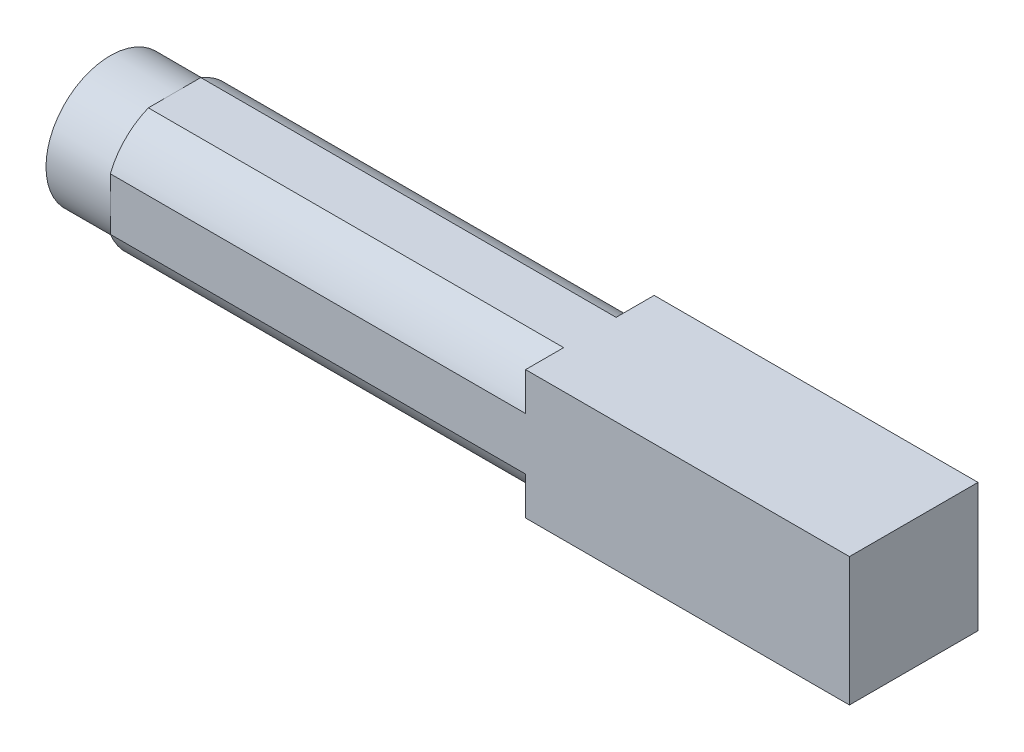
ISO-10303-21;
HEADER;
FILE_DESCRIPTION(('STEP AP214'),'2;1');
FILE_NAME('part.step','',(''),(''),'','','');
FILE_SCHEMA(('AUTOMOTIVE_DESIGN { 1 0 10303 214 1 1 1 1 }'));
ENDSEC;
DATA;
#1=APPLICATION_CONTEXT('core data for automotive mechanical design processes');
#2=APPLICATION_PROTOCOL_DEFINITION('international standard','automotive_design',2000,#1);
#3=PRODUCT_CONTEXT('',#1,'mechanical');
#4=PRODUCT('Part','Part','',(#3));
#5=PRODUCT_RELATED_PRODUCT_CATEGORY('part','',(#4));
#6=PRODUCT_DEFINITION_FORMATION('','',#4);
#7=PRODUCT_DEFINITION_CONTEXT('part definition',#1,'design');
#8=PRODUCT_DEFINITION('design','',#6,#7);
#9=PRODUCT_DEFINITION_SHAPE('','',#8);
#10=(LENGTH_UNIT() NAMED_UNIT(*) SI_UNIT(.MILLI.,.METRE.));
#11=(NAMED_UNIT(*) PLANE_ANGLE_UNIT() SI_UNIT($,.RADIAN.));
#12=(NAMED_UNIT(*) SI_UNIT($,.STERADIAN.) SOLID_ANGLE_UNIT());
#13=UNCERTAINTY_MEASURE_WITH_UNIT(LENGTH_MEASURE(1.E-05),#10,'distance_accuracy_value','');
#14=(GEOMETRIC_REPRESENTATION_CONTEXT(3) GLOBAL_UNCERTAINTY_ASSIGNED_CONTEXT((#13)) GLOBAL_UNIT_ASSIGNED_CONTEXT((#10,
#11,#12)) REPRESENTATION_CONTEXT('',''));
#15=CARTESIAN_POINT('',(0.,0.,0.));
#16=DIRECTION('',(0.,0.,1.));
#17=DIRECTION('',(1.,0.,0.));
#18=AXIS2_PLACEMENT_3D('',#15,#16,#17);
#19=CARTESIAN_POINT('',(39.6875,-3.175,-3.175));
#20=DIRECTION('',(0.,0.,1.));
#21=DIRECTION('',(1.,0.,0.));
#22=AXIS2_PLACEMENT_3D('',#19,#20,#21);
#23=PLANE('',#22);
#24=DIRECTION('',(-1.,0.,0.));
#25=VECTOR('',#24,1.);
#26=CARTESIAN_POINT('',(36.8423013006725,-1.29515095645257,-3.175));
#27=LINE('',#26,#25);
#28=CARTESIAN_POINT('',(3.175,-1.29515095645257,-3.175));
#29=VERTEX_POINT('',#28);
#30=CARTESIAN_POINT('',(23.6906250002226,-1.29515095645257,-3.175));
#31=VERTEX_POINT('',#30);
#32=EDGE_CURVE('E278',#29,#31,#27,.F.);
#33=ORIENTED_EDGE('',*,*,#32,.F.);
#34=DIRECTION('',(0.,1.,0.));
#35=VECTOR('',#34,1.);
#36=CARTESIAN_POINT('',(3.175,-3.175,-3.175));
#37=LINE('',#36,#35);
#38=CARTESIAN_POINT('',(3.175,0.,-3.175));
#39=VERTEX_POINT('',#38);
#40=EDGE_CURVE('E205',#29,#39,#37,.T.);
#41=ORIENTED_EDGE('',*,*,#40,.T.);
#42=CARTESIAN_POINT('',(3.175,1.29515095645257,-3.175));
#43=VERTEX_POINT('',#42);
#44=EDGE_CURVE('E201',#39,#43,#37,.T.);
#45=ORIENTED_EDGE('',*,*,#44,.T.);
#46=DIRECTION('',(-1.,0.,0.));
#47=VECTOR('',#46,1.);
#48=CARTESIAN_POINT('',(36.8423013006725,1.29515095645257,-3.175));
#49=LINE('',#48,#47);
#50=CARTESIAN_POINT('',(23.6906250002226,1.29515095645257,-3.175));
#51=VERTEX_POINT('',#50);
#52=EDGE_CURVE('E70',#51,#43,#49,.T.);
#53=ORIENTED_EDGE('',*,*,#52,.F.);
#54=DIRECTION('',(0.,1.,0.));
#55=VECTOR('',#54,1.);
#56=CARTESIAN_POINT('',(23.6906250002226,-3.175,-3.175));
#57=LINE('',#56,#55);
#58=CARTESIAN_POINT('',(23.6906250002226,3.175,-3.175));
#59=VERTEX_POINT('',#58);
#60=EDGE_CURVE('E260',#51,#59,#57,.T.);
#61=ORIENTED_EDGE('',*,*,#60,.T.);
#62=DIRECTION('',(-1.,0.,0.));
#63=VECTOR('',#62,1.);
#64=CARTESIAN_POINT('',(39.6875,3.175,-3.175));
#65=LINE('',#64,#63);
#66=CARTESIAN_POINT('',(39.6875,3.175,-3.175));
#67=VERTEX_POINT('',#66);
#68=EDGE_CURVE('E226',#67,#59,#65,.T.);
#69=ORIENTED_EDGE('',*,*,#68,.F.);
#70=DIRECTION('',(0.,1.,0.));
#71=VECTOR('',#70,1.);
#72=CARTESIAN_POINT('',(39.6875,-3.175,-3.175));
#73=LINE('',#72,#71);
#74=CARTESIAN_POINT('',(39.6875,-3.175,-3.175));
#75=VERTEX_POINT('',#74);
#76=EDGE_CURVE('E206',#75,#67,#73,.T.);
#77=ORIENTED_EDGE('',*,*,#76,.F.);
#78=DIRECTION('',(-1.,0.,0.));
#79=VECTOR('',#78,1.);
#80=CARTESIAN_POINT('',(39.6875,-3.175,-3.175));
#81=LINE('',#80,#79);
#82=CARTESIAN_POINT('',(23.6906250002226,-3.175,-3.175));
#83=VERTEX_POINT('',#82);
#84=EDGE_CURVE('E215',#75,#83,#81,.T.);
#85=ORIENTED_EDGE('',*,*,#84,.T.);
#86=EDGE_CURVE('E277',#83,#31,#57,.T.);
#87=ORIENTED_EDGE('',*,*,#86,.T.);
#88=EDGE_LOOP('',(#33,#41,#45,#53,#61,#69,#77,#85,#87));
#89=FACE_BOUND('',#88,.T.);
#90=ADVANCED_FACE('F45',(#89),#23,.F.);
#91=CARTESIAN_POINT('',(39.6875,3.175,3.175));
#92=DIRECTION('',(0.,-1.,0.));
#93=DIRECTION('',(0.,0.,-1.));
#94=AXIS2_PLACEMENT_3D('',#91,#92,#93);
#95=PLANE('',#94);
#96=DIRECTION('',(-1.,0.,0.));
#97=VECTOR('',#96,1.);
#98=CARTESIAN_POINT('',(36.8423013006725,3.175,-1.29515095645257));
#99=LINE('',#98,#97);
#100=CARTESIAN_POINT('',(3.175,3.175,-1.29515095645257));
#101=VERTEX_POINT('',#100);
#102=CARTESIAN_POINT('',(23.6906250002226,3.175,-1.29515095645257));
#103=VERTEX_POINT('',#102);
#104=EDGE_CURVE('E273',#101,#103,#99,.F.);
#105=ORIENTED_EDGE('',*,*,#104,.F.);
#106=DIRECTION('',(0.,0.,1.));
#107=VECTOR('',#106,1.);
#108=CARTESIAN_POINT('',(3.175,3.175,3.175));
#109=LINE('',#108,#107);
#110=CARTESIAN_POINT('',(3.175,3.175,0.));
#111=VERTEX_POINT('',#110);
#112=EDGE_CURVE('E196',#101,#111,#109,.T.);
#113=ORIENTED_EDGE('',*,*,#112,.T.);
#114=CARTESIAN_POINT('',(3.175,3.175,1.29515095645257));
#115=VERTEX_POINT('',#114);
#116=EDGE_CURVE('E193',#111,#115,#109,.T.);
#117=ORIENTED_EDGE('',*,*,#116,.T.);
#118=DIRECTION('',(-1.,0.,0.));
#119=VECTOR('',#118,1.);
#120=CARTESIAN_POINT('',(36.8423013006725,3.175,1.29515095645257));
#121=LINE('',#120,#119);
#122=CARTESIAN_POINT('',(23.6906250002226,3.175,1.29515095645257));
#123=VERTEX_POINT('',#122);
#124=EDGE_CURVE('E169',#123,#115,#121,.T.);
#125=ORIENTED_EDGE('',*,*,#124,.F.);
#126=DIRECTION('',(0.,0.,1.));
#127=VECTOR('',#126,1.);
#128=CARTESIAN_POINT('',(23.6906250002226,3.175,3.17500000000001));
#129=LINE('',#128,#127);
#130=CARTESIAN_POINT('',(23.6906250002226,3.175,3.175));
#131=VERTEX_POINT('',#130);
#132=EDGE_CURVE('E272',#123,#131,#129,.T.);
#133=ORIENTED_EDGE('',*,*,#132,.T.);
#134=DIRECTION('',(-1.,0.,0.));
#135=VECTOR('',#134,1.);
#136=CARTESIAN_POINT('',(39.6875,3.175,3.175));
#137=LINE('',#136,#135);
#138=CARTESIAN_POINT('',(39.6875,3.175,3.175));
#139=VERTEX_POINT('',#138);
#140=EDGE_CURVE('E223',#139,#131,#137,.T.);
#141=ORIENTED_EDGE('',*,*,#140,.F.);
#142=DIRECTION('',(0.,0.,1.));
#143=VECTOR('',#142,1.);
#144=CARTESIAN_POINT('',(39.6875,3.175,3.175));
#145=LINE('',#144,#143);
#146=EDGE_CURVE('E209',#67,#139,#145,.T.);
#147=ORIENTED_EDGE('',*,*,#146,.F.);
#148=ORIENTED_EDGE('',*,*,#68,.T.);
#149=EDGE_CURVE('E269',#59,#103,#129,.T.);
#150=ORIENTED_EDGE('',*,*,#149,.T.);
#151=EDGE_LOOP('',(#105,#113,#117,#125,#133,#141,#147,#148,#150));
#152=FACE_BOUND('',#151,.T.);
#153=ADVANCED_FACE('F324',(#152),#95,.F.);
#154=CARTESIAN_POINT('',(39.6875,-3.175,3.175));
#155=DIRECTION('',(0.,0.,-1.));
#156=DIRECTION('',(-1.,0.,0.));
#157=AXIS2_PLACEMENT_3D('',#154,#155,#156);
#158=PLANE('',#157);
#159=DIRECTION('',(-1.,0.,0.));
#160=VECTOR('',#159,1.);
#161=CARTESIAN_POINT('',(36.8423013006725,1.29515095645257,3.175));
#162=LINE('',#161,#160);
#163=CARTESIAN_POINT('',(3.175,1.29515095645257,3.175));
#164=VERTEX_POINT('',#163);
#165=CARTESIAN_POINT('',(23.6906250002226,1.29515095645257,3.175));
#166=VERTEX_POINT('',#165);
#167=EDGE_CURVE('E166',#164,#166,#162,.F.);
#168=ORIENTED_EDGE('',*,*,#167,.F.);
#169=DIRECTION('',(0.,-1.,0.));
#170=VECTOR('',#169,1.);
#171=CARTESIAN_POINT('',(3.175,-3.175,3.175));
#172=LINE('',#171,#170);
#173=CARTESIAN_POINT('',(3.175,0.,3.175));
#174=VERTEX_POINT('',#173);
#175=EDGE_CURVE('E182',#164,#174,#172,.T.);
#176=ORIENTED_EDGE('',*,*,#175,.T.);
#177=CARTESIAN_POINT('',(3.175,-1.29515095645257,3.175));
#178=VERTEX_POINT('',#177);
#179=EDGE_CURVE('E194',#174,#178,#172,.T.);
#180=ORIENTED_EDGE('',*,*,#179,.T.);
#181=DIRECTION('',(-1.,0.,0.));
#182=VECTOR('',#181,1.);
#183=CARTESIAN_POINT('',(36.8423013006725,-1.29515095645257,3.175));
#184=LINE('',#183,#182);
#185=CARTESIAN_POINT('',(23.6906250002226,-1.29515095645257,3.175));
#186=VERTEX_POINT('',#185);
#187=EDGE_CURVE('E187',#186,#178,#184,.T.);
#188=ORIENTED_EDGE('',*,*,#187,.F.);
#189=DIRECTION('',(0.,-1.,0.));
#190=VECTOR('',#189,1.);
#191=CARTESIAN_POINT('',(23.6906250002226,-3.175,3.175));
#192=LINE('',#191,#190);
#193=CARTESIAN_POINT('',(23.6906250002226,-3.175,3.175));
#194=VERTEX_POINT('',#193);
#195=EDGE_CURVE('E296',#186,#194,#192,.T.);
#196=ORIENTED_EDGE('',*,*,#195,.T.);
#197=DIRECTION('',(-1.,0.,0.));
#198=VECTOR('',#197,1.);
#199=CARTESIAN_POINT('',(39.6875,-3.175,3.175));
#200=LINE('',#199,#198);
#201=CARTESIAN_POINT('',(39.6875,-3.175,3.175));
#202=VERTEX_POINT('',#201);
#203=EDGE_CURVE('E219',#202,#194,#200,.T.);
#204=ORIENTED_EDGE('',*,*,#203,.F.);
#205=DIRECTION('',(0.,-1.,0.));
#206=VECTOR('',#205,1.);
#207=CARTESIAN_POINT('',(39.6875,-3.175,3.175));
#208=LINE('',#207,#206);
#209=EDGE_CURVE('E211',#139,#202,#208,.T.);
#210=ORIENTED_EDGE('',*,*,#209,.F.);
#211=ORIENTED_EDGE('',*,*,#140,.T.);
#212=EDGE_CURVE('E185',#131,#166,#192,.T.);
#213=ORIENTED_EDGE('',*,*,#212,.T.);
#214=EDGE_LOOP('',(#168,#176,#180,#188,#196,#204,#210,#211,#213));
#215=FACE_BOUND('',#214,.T.);
#216=ADVANCED_FACE('F180',(#215),#158,.F.);
#217=CARTESIAN_POINT('',(39.6875,-3.175,3.175));
#218=DIRECTION('',(0.,1.,0.));
#219=DIRECTION('',(0.,0.,1.));
#220=AXIS2_PLACEMENT_3D('',#217,#218,#219);
#221=PLANE('',#220);
#222=DIRECTION('',(-1.,0.,0.));
#223=VECTOR('',#222,1.);
#224=CARTESIAN_POINT('',(36.8423013006725,-3.175,1.29515095645257));
#225=LINE('',#224,#223);
#226=CARTESIAN_POINT('',(3.175,-3.175,1.29515095645257));
#227=VERTEX_POINT('',#226);
#228=CARTESIAN_POINT('',(23.6906250002226,-3.175,1.29515095645257));
#229=VERTEX_POINT('',#228);
#230=EDGE_CURVE('E246',#227,#229,#225,.F.);
#231=ORIENTED_EDGE('',*,*,#230,.F.);
#232=DIRECTION('',(0.,0.,-1.));
#233=VECTOR('',#232,1.);
#234=CARTESIAN_POINT('',(3.175,-3.175,3.175));
#235=LINE('',#234,#233);
#236=CARTESIAN_POINT('',(3.175,-3.175,0.));
#237=VERTEX_POINT('',#236);
#238=EDGE_CURVE('E235',#227,#237,#235,.T.);
#239=ORIENTED_EDGE('',*,*,#238,.T.);
#240=CARTESIAN_POINT('',(3.175,-3.175,-1.29515095645257));
#241=VERTEX_POINT('',#240);
#242=EDGE_CURVE('E233',#237,#241,#235,.T.);
#243=ORIENTED_EDGE('',*,*,#242,.T.);
#244=DIRECTION('',(-1.,0.,0.));
#245=VECTOR('',#244,1.);
#246=CARTESIAN_POINT('',(36.8423013006725,-3.175,-1.29515095645257));
#247=LINE('',#246,#245);
#248=CARTESIAN_POINT('',(23.6906250002226,-3.175,-1.29515095645257));
#249=VERTEX_POINT('',#248);
#250=EDGE_CURVE('E60',#249,#241,#247,.T.);
#251=ORIENTED_EDGE('',*,*,#250,.F.);
#252=DIRECTION('',(0.,0.,-1.));
#253=VECTOR('',#252,1.);
#254=CARTESIAN_POINT('',(23.6906250002226,-3.175,3.17500000000001));
#255=LINE('',#254,#253);
#256=EDGE_CURVE('E48',#249,#83,#255,.T.);
#257=ORIENTED_EDGE('',*,*,#256,.T.);
#258=ORIENTED_EDGE('',*,*,#84,.F.);
#259=DIRECTION('',(0.,0.,-1.));
#260=VECTOR('',#259,1.);
#261=CARTESIAN_POINT('',(39.6875,-3.175,3.175));
#262=LINE('',#261,#260);
#263=EDGE_CURVE('E213',#202,#75,#262,.T.);
#264=ORIENTED_EDGE('',*,*,#263,.F.);
#265=ORIENTED_EDGE('',*,*,#203,.T.);
#266=EDGE_CURVE('E11',#194,#229,#255,.T.);
#267=ORIENTED_EDGE('',*,*,#266,.T.);
#268=EDGE_LOOP('',(#231,#239,#243,#251,#257,#258,#264,#265,#267));
#269=FACE_BOUND('',#268,.T.);
#270=ADVANCED_FACE('F245',(#269),#221,.F.);
#271=CARTESIAN_POINT('',(3.175,0.,0.));
#272=DIRECTION('',(1.,0.,0.));
#273=DIRECTION('',(0.,0.,-1.));
#274=AXIS2_PLACEMENT_3D('',#271,#272,#273);
#275=PLANE('',#274);
#276=CARTESIAN_POINT('',(3.175,0.,0.));
#277=DIRECTION('',(-1.,0.,0.));
#278=DIRECTION('',(0.,0.,1.));
#279=AXIS2_PLACEMENT_3D('',#276,#277,#278);
#280=CIRCLE('',#279,3.429);
#281=EDGE_CURVE('E177',#29,#241,#280,.T.);
#282=ORIENTED_EDGE('',*,*,#281,.T.);
#283=ORIENTED_EDGE('',*,*,#242,.F.);
#284=CARTESIAN_POINT('',(3.175,0.,0.));
#285=DIRECTION('',(-1.,0.,0.));
#286=DIRECTION('',(0.,0.,1.));
#287=AXIS2_PLACEMENT_3D('',#284,#285,#286);
#288=CIRCLE('',#287,3.175);
#289=EDGE_CURVE('E254',#39,#237,#288,.T.);
#290=ORIENTED_EDGE('',*,*,#289,.F.);
#291=ORIENTED_EDGE('',*,*,#40,.F.);
#292=EDGE_LOOP('',(#282,#283,#290,#291));
#293=FACE_BOUND('',#292,.T.);
#294=ADVANCED_FACE('F251',(#293),#275,.F.);
#295=EDGE_CURVE('E175',#101,#43,#280,.T.);
#296=ORIENTED_EDGE('',*,*,#295,.T.);
#297=ORIENTED_EDGE('',*,*,#44,.F.);
#298=EDGE_CURVE('E263',#111,#39,#288,.T.);
#299=ORIENTED_EDGE('',*,*,#298,.F.);
#300=ORIENTED_EDGE('',*,*,#112,.F.);
#301=EDGE_LOOP('',(#296,#297,#299,#300));
#302=FACE_BOUND('',#301,.T.);
#303=ADVANCED_FACE('F359',(#302),#275,.F.);
#304=EDGE_CURVE('E162',#164,#115,#280,.T.);
#305=ORIENTED_EDGE('',*,*,#304,.T.);
#306=ORIENTED_EDGE('',*,*,#116,.F.);
#307=EDGE_CURVE('E192',#174,#111,#288,.T.);
#308=ORIENTED_EDGE('',*,*,#307,.F.);
#309=ORIENTED_EDGE('',*,*,#175,.F.);
#310=EDGE_LOOP('',(#305,#306,#308,#309));
#311=FACE_BOUND('',#310,.T.);
#312=ADVANCED_FACE('F190',(#311),#275,.F.);
#313=CARTESIAN_POINT('',(3.175,0.,0.));
#314=DIRECTION('',(1.,0.,0.));
#315=DIRECTION('',(0.,0.,-1.));
#316=AXIS2_PLACEMENT_3D('',#313,#314,#315);
#317=CIRCLE('',#316,3.429);
#318=EDGE_CURVE('E236',#178,#227,#317,.T.);
#319=ORIENTED_EDGE('',*,*,#318,.F.);
#320=ORIENTED_EDGE('',*,*,#179,.F.);
#321=EDGE_CURVE('E257',#237,#174,#288,.T.);
#322=ORIENTED_EDGE('',*,*,#321,.F.);
#323=ORIENTED_EDGE('',*,*,#238,.F.);
#324=EDGE_LOOP('',(#319,#320,#322,#323));
#325=FACE_BOUND('',#324,.T.);
#326=ADVANCED_FACE('F258',(#325),#275,.F.);
#327=CARTESIAN_POINT('',(39.6875,0.,0.));
#328=DIRECTION('',(-1.,0.,0.));
#329=DIRECTION('',(0.,0.,1.));
#330=AXIS2_PLACEMENT_3D('',#327,#328,#329);
#331=PLANE('',#330);
#332=ORIENTED_EDGE('',*,*,#76,.T.);
#333=ORIENTED_EDGE('',*,*,#146,.T.);
#334=ORIENTED_EDGE('',*,*,#209,.T.);
#335=ORIENTED_EDGE('',*,*,#263,.T.);
#336=EDGE_LOOP('',(#332,#333,#334,#335));
#337=FACE_BOUND('',#336,.T.);
#338=ADVANCED_FACE('F319',(#337),#331,.F.);
#339=CARTESIAN_POINT('',(3.175,0.,0.));
#340=DIRECTION('',(-1.,0.,0.));
#341=DIRECTION('',(0.,0.,1.));
#342=AXIS2_PLACEMENT_3D('',#339,#340,#341);
#343=CYLINDRICAL_SURFACE('',#342,3.175);
#344=CARTESIAN_POINT('',(0.,0.,0.));
#345=DIRECTION('',(-1.,0.,0.));
#346=DIRECTION('',(0.,0.,1.));
#347=AXIS2_PLACEMENT_3D('',#344,#345,#346);
#348=CIRCLE('',#347,3.175);
#349=CARTESIAN_POINT('',(0.,0.,3.175));
#350=VERTEX_POINT('',#349);
#351=EDGE_CURVE('E230',#350,#350,#348,.T.);
#352=ORIENTED_EDGE('',*,*,#351,.F.);
#353=EDGE_LOOP('',(#352));
#354=FACE_BOUND('',#353,.T.);
#355=ORIENTED_EDGE('',*,*,#298,.T.);
#356=ORIENTED_EDGE('',*,*,#289,.T.);
#357=ORIENTED_EDGE('',*,*,#321,.T.);
#358=ORIENTED_EDGE('',*,*,#307,.T.);
#359=EDGE_LOOP('',(#355,#356,#357,#358));
#360=FACE_BOUND('',#359,.T.);
#361=ADVANCED_FACE('F261',(#354,#360),#343,.T.);
#362=CARTESIAN_POINT('',(0.,0.,0.));
#363=DIRECTION('',(-1.,0.,0.));
#364=DIRECTION('',(0.,0.,1.));
#365=AXIS2_PLACEMENT_3D('',#362,#363,#364);
#366=PLANE('',#365);
#367=ORIENTED_EDGE('',*,*,#351,.T.);
#368=EDGE_LOOP('',(#367));
#369=FACE_BOUND('',#368,.T.);
#370=ADVANCED_FACE('F370',(#369),#366,.T.);
#371=CARTESIAN_POINT('',(36.8423013006725,0.,0.));
#372=DIRECTION('',(-1.,0.,0.));
#373=DIRECTION('',(0.,0.,1.));
#374=AXIS2_PLACEMENT_3D('',#371,#372,#373);
#375=CYLINDRICAL_SURFACE('',#374,3.429);
#376=ORIENTED_EDGE('',*,*,#187,.T.);
#377=ORIENTED_EDGE('',*,*,#318,.T.);
#378=ORIENTED_EDGE('',*,*,#230,.T.);
#379=CARTESIAN_POINT('',(23.6906250002226,0.,0.));
#380=DIRECTION('',(1.,0.,0.));
#381=DIRECTION('',(0.,0.,-1.));
#382=AXIS2_PLACEMENT_3D('',#379,#380,#381);
#383=CIRCLE('',#382,3.429);
#384=EDGE_CURVE('E290',#229,#186,#383,.F.);
#385=ORIENTED_EDGE('',*,*,#384,.T.);
#386=EDGE_LOOP('',(#376,#377,#378,#385));
#387=FACE_BOUND('',#386,.T.);
#388=ADVANCED_FACE('F339',(#387),#375,.T.);
#389=CARTESIAN_POINT('',(23.6906250002226,0.,0.));
#390=DIRECTION('',(1.,0.,0.));
#391=DIRECTION('',(0.,-0.999971670542506,-0.00752715832364226));
#392=AXIS2_PLACEMENT_3D('',#389,#390,#391);
#393=PLANE('',#392);
#394=ORIENTED_EDGE('',*,*,#384,.F.);
#395=ORIENTED_EDGE('',*,*,#266,.F.);
#396=ORIENTED_EDGE('',*,*,#195,.F.);
#397=EDGE_LOOP('',(#394,#395,#396));
#398=FACE_BOUND('',#397,.T.);
#399=ADVANCED_FACE('F330',(#398),#393,.F.);
#400=ORIENTED_EDGE('',*,*,#124,.T.);
#401=ORIENTED_EDGE('',*,*,#304,.F.);
#402=ORIENTED_EDGE('',*,*,#167,.T.);
#403=EDGE_CURVE('E281',#166,#123,#383,.F.);
#404=ORIENTED_EDGE('',*,*,#403,.T.);
#405=EDGE_LOOP('',(#400,#401,#402,#404));
#406=FACE_BOUND('',#405,.T.);
#407=ADVANCED_FACE('F164',(#406),#375,.T.);
#408=ORIENTED_EDGE('',*,*,#403,.F.);
#409=ORIENTED_EDGE('',*,*,#212,.F.);
#410=ORIENTED_EDGE('',*,*,#132,.F.);
#411=EDGE_LOOP('',(#408,#409,#410));
#412=FACE_BOUND('',#411,.T.);
#413=ADVANCED_FACE('F326',(#412),#393,.F.);
#414=ORIENTED_EDGE('',*,*,#52,.T.);
#415=ORIENTED_EDGE('',*,*,#295,.F.);
#416=ORIENTED_EDGE('',*,*,#104,.T.);
#417=EDGE_CURVE('E174',#103,#51,#383,.F.);
#418=ORIENTED_EDGE('',*,*,#417,.T.);
#419=EDGE_LOOP('',(#414,#415,#416,#418));
#420=FACE_BOUND('',#419,.T.);
#421=ADVANCED_FACE('F328',(#420),#375,.T.);
#422=ORIENTED_EDGE('',*,*,#417,.F.);
#423=ORIENTED_EDGE('',*,*,#149,.F.);
#424=ORIENTED_EDGE('',*,*,#60,.F.);
#425=EDGE_LOOP('',(#422,#423,#424));
#426=FACE_BOUND('',#425,.T.);
#427=ADVANCED_FACE('F331',(#426),#393,.F.);
#428=ORIENTED_EDGE('',*,*,#256,.F.);
#429=EDGE_CURVE('E283',#31,#249,#383,.F.);
#430=ORIENTED_EDGE('',*,*,#429,.F.);
#431=ORIENTED_EDGE('',*,*,#86,.F.);
#432=EDGE_LOOP('',(#428,#430,#431));
#433=FACE_BOUND('',#432,.T.);
#434=ADVANCED_FACE('F343',(#433),#393,.F.);
#435=ORIENTED_EDGE('',*,*,#32,.T.);
#436=ORIENTED_EDGE('',*,*,#429,.T.);
#437=ORIENTED_EDGE('',*,*,#250,.T.);
#438=ORIENTED_EDGE('',*,*,#281,.F.);
#439=EDGE_LOOP('',(#435,#436,#437,#438));
#440=FACE_BOUND('',#439,.T.);
#441=ADVANCED_FACE('F338',(#440),#375,.T.);
#442=CLOSED_SHELL('',(#90,#153,#216,#270,#294,#303,#312,#326,#338,#361,#370,#388,#399,#407,#413,
#421,#427,#434,#441));
#443=MANIFOLD_SOLID_BREP('B2',#442);
#444=ADVANCED_BREP_SHAPE_REPRESENTATION('',(#18,#443),#14);
#445=SHAPE_DEFINITION_REPRESENTATION(#9,#444);
ENDSEC;
END-ISO-10303-21;
